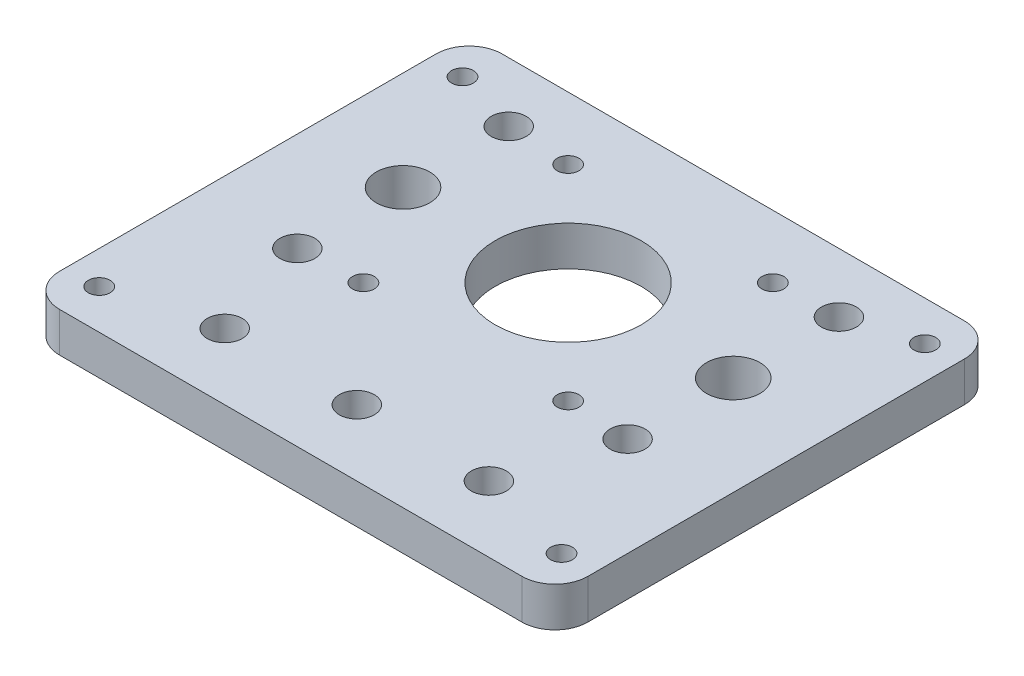
ISO-10303-21;
HEADER;
FILE_DESCRIPTION(('STEP AP214'),'2;1');
FILE_NAME('part.step','',(''),(''),'','','');
FILE_SCHEMA(('AUTOMOTIVE_DESIGN { 1 0 10303 214 1 1 1 1 }'));
ENDSEC;
DATA;
#1=APPLICATION_CONTEXT('core data for automotive mechanical design processes');
#2=APPLICATION_PROTOCOL_DEFINITION('international standard','automotive_design',2000,#1);
#3=PRODUCT_CONTEXT('',#1,'mechanical');
#4=PRODUCT('Part','Part','',(#3));
#5=PRODUCT_RELATED_PRODUCT_CATEGORY('part','',(#4));
#6=PRODUCT_DEFINITION_FORMATION('','',#4);
#7=PRODUCT_DEFINITION_CONTEXT('part definition',#1,'design');
#8=PRODUCT_DEFINITION('design','',#6,#7);
#9=PRODUCT_DEFINITION_SHAPE('','',#8);
#10=(LENGTH_UNIT() NAMED_UNIT(*) SI_UNIT(.MILLI.,.METRE.));
#11=(NAMED_UNIT(*) PLANE_ANGLE_UNIT() SI_UNIT($,.RADIAN.));
#12=(NAMED_UNIT(*) SI_UNIT($,.STERADIAN.) SOLID_ANGLE_UNIT());
#13=UNCERTAINTY_MEASURE_WITH_UNIT(LENGTH_MEASURE(1.E-05),#10,'distance_accuracy_value','');
#14=(GEOMETRIC_REPRESENTATION_CONTEXT(3) GLOBAL_UNCERTAINTY_ASSIGNED_CONTEXT((#13)) GLOBAL_UNIT_ASSIGNED_CONTEXT((#10,
#11,#12)) REPRESENTATION_CONTEXT('',''));
#15=CARTESIAN_POINT('',(0.,0.,0.));
#16=DIRECTION('',(0.,0.,1.));
#17=DIRECTION('',(1.,0.,0.));
#18=AXIS2_PLACEMENT_3D('',#15,#16,#17);
#19=CARTESIAN_POINT('',(-35.,6.,37.));
#20=DIRECTION('',(0.,1.,0.));
#21=DIRECTION('',(0.,0.,1.));
#22=AXIS2_PLACEMENT_3D('',#19,#20,#21);
#23=PLANE('',#22);
#24=CARTESIAN_POINT('',(35.,6.,36.));
#25=DIRECTION('',(0.,1.,0.));
#26=DIRECTION('',(0.,0.,-1.));
#27=AXIS2_PLACEMENT_3D('',#24,#25,#26);
#28=CIRCLE('',#27,1.65);
#29=CARTESIAN_POINT('',(35.,6.,34.35));
#30=VERTEX_POINT('',#29);
#31=EDGE_CURVE('E274',#30,#30,#28,.T.);
#32=ORIENTED_EDGE('',*,*,#31,.F.);
#33=EDGE_LOOP('',(#32));
#34=FACE_BOUND('',#33,.T.);
#35=CARTESIAN_POINT('',(20.,6.,32.));
#36=DIRECTION('',(0.,1.,0.));
#37=DIRECTION('',(0.,0.,1.));
#38=AXIS2_PLACEMENT_3D('',#35,#36,#37);
#39=CIRCLE('',#38,2.65);
#40=CARTESIAN_POINT('',(20.,6.,34.65));
#41=VERTEX_POINT('',#40);
#42=EDGE_CURVE('E262',#41,#41,#39,.T.);
#43=ORIENTED_EDGE('',*,*,#42,.F.);
#44=EDGE_LOOP('',(#43));
#45=FACE_BOUND('',#44,.T.);
#46=CARTESIAN_POINT('',(-35.,6.,36.));
#47=DIRECTION('',(0.,1.,0.));
#48=DIRECTION('',(0.,0.,1.));
#49=AXIS2_PLACEMENT_3D('',#46,#47,#48);
#50=CIRCLE('',#49,1.65);
#51=CARTESIAN_POINT('',(-35.,6.,37.65));
#52=VERTEX_POINT('',#51);
#53=EDGE_CURVE('E250',#52,#52,#50,.T.);
#54=ORIENTED_EDGE('',*,*,#53,.F.);
#55=EDGE_LOOP('',(#54));
#56=FACE_BOUND('',#55,.T.);
#57=CARTESIAN_POINT('',(25.,6.,-16.));
#58=DIRECTION('',(0.,1.,0.));
#59=DIRECTION('',(0.,0.,-1.));
#60=AXIS2_PLACEMENT_3D('',#57,#58,#59);
#61=CIRCLE('',#60,2.65);
#62=CARTESIAN_POINT('',(25.,6.,-18.65));
#63=VERTEX_POINT('',#62);
#64=EDGE_CURVE('E238',#63,#63,#61,.T.);
#65=ORIENTED_EDGE('',*,*,#64,.F.);
#66=EDGE_LOOP('',(#65));
#67=FACE_BOUND('',#66,.T.);
#68=CARTESIAN_POINT('',(25.,6.,0.));
#69=DIRECTION('',(0.,1.,0.));
#70=DIRECTION('',(0.,0.,-1.));
#71=AXIS2_PLACEMENT_3D('',#68,#69,#70);
#72=CIRCLE('',#71,4.05);
#73=CARTESIAN_POINT('',(25.,6.,-4.05));
#74=VERTEX_POINT('',#73);
#75=EDGE_CURVE('E226',#74,#74,#72,.T.);
#76=ORIENTED_EDGE('',*,*,#75,.F.);
#77=EDGE_LOOP('',(#76));
#78=FACE_BOUND('',#77,.T.);
#79=CARTESIAN_POINT('',(-25.,6.,-16.));
#80=DIRECTION('',(0.,1.,0.));
#81=DIRECTION('',(0.,0.,1.));
#82=AXIS2_PLACEMENT_3D('',#79,#80,#81);
#83=CIRCLE('',#82,2.65);
#84=CARTESIAN_POINT('',(-25.,6.,-13.35));
#85=VERTEX_POINT('',#84);
#86=EDGE_CURVE('E214',#85,#85,#83,.T.);
#87=ORIENTED_EDGE('',*,*,#86,.F.);
#88=EDGE_LOOP('',(#87));
#89=FACE_BOUND('',#88,.T.);
#90=CARTESIAN_POINT('',(-15.5,6.,15.5));
#91=DIRECTION('',(0.,1.,0.));
#92=DIRECTION('',(0.,0.,1.));
#93=AXIS2_PLACEMENT_3D('',#90,#91,#92);
#94=CIRCLE('',#93,1.65);
#95=CARTESIAN_POINT('',(-15.5,6.,17.15));
#96=VERTEX_POINT('',#95);
#97=EDGE_CURVE('E202',#96,#96,#94,.T.);
#98=ORIENTED_EDGE('',*,*,#97,.F.);
#99=EDGE_LOOP('',(#98));
#100=FACE_BOUND('',#99,.T.);
#101=CARTESIAN_POINT('',(15.5,6.,-15.5));
#102=DIRECTION('',(0.,1.,0.));
#103=DIRECTION('',(0.,0.,1.));
#104=AXIS2_PLACEMENT_3D('',#101,#102,#103);
#105=CIRCLE('',#104,1.65);
#106=CARTESIAN_POINT('',(15.5,6.,-13.85));
#107=VERTEX_POINT('',#106);
#108=EDGE_CURVE('E190',#107,#107,#105,.T.);
#109=ORIENTED_EDGE('',*,*,#108,.F.);
#110=EDGE_LOOP('',(#109));
#111=FACE_BOUND('',#110,.T.);
#112=CARTESIAN_POINT('',(0.,6.,0.));
#113=DIRECTION('',(0.,1.,0.));
#114=DIRECTION('',(0.,0.,1.));
#115=AXIS2_PLACEMENT_3D('',#112,#113,#114);
#116=CIRCLE('',#115,11.05);
#117=CARTESIAN_POINT('',(0.,6.,11.05));
#118=VERTEX_POINT('',#117);
#119=EDGE_CURVE('E136',#118,#118,#116,.T.);
#120=ORIENTED_EDGE('',*,*,#119,.F.);
#121=EDGE_LOOP('',(#120));
#122=FACE_BOUND('',#121,.T.);
#123=CARTESIAN_POINT('',(-35.,6.,37.));
#124=DIRECTION('',(0.,1.,0.));
#125=DIRECTION('',(0.,0.,1.));
#126=AXIS2_PLACEMENT_3D('',#123,#124,#125);
#127=CIRCLE('',#126,5.);
#128=CARTESIAN_POINT('',(-40.,6.,37.));
#129=VERTEX_POINT('',#128);
#130=CARTESIAN_POINT('',(-35.,6.,42.));
#131=VERTEX_POINT('',#130);
#132=EDGE_CURVE('E147',#129,#131,#127,.T.);
#133=ORIENTED_EDGE('',*,*,#132,.T.);
#134=DIRECTION('',(1.,0.,0.));
#135=VECTOR('',#134,1.);
#136=CARTESIAN_POINT('',(-35.,6.,42.));
#137=LINE('',#136,#135);
#138=CARTESIAN_POINT('',(35.,6.,42.));
#139=VERTEX_POINT('',#138);
#140=EDGE_CURVE('E95',#131,#139,#137,.T.);
#141=ORIENTED_EDGE('',*,*,#140,.T.);
#142=CARTESIAN_POINT('',(35.,6.,37.));
#143=DIRECTION('',(0.,1.,0.));
#144=DIRECTION('',(0.,0.,1.));
#145=AXIS2_PLACEMENT_3D('',#142,#143,#144);
#146=CIRCLE('',#145,5.);
#147=CARTESIAN_POINT('',(40.,6.,37.));
#148=VERTEX_POINT('',#147);
#149=EDGE_CURVE('E162',#139,#148,#146,.T.);
#150=ORIENTED_EDGE('',*,*,#149,.T.);
#151=DIRECTION('',(0.,0.,-1.));
#152=VECTOR('',#151,1.);
#153=CARTESIAN_POINT('',(40.,6.,-20.));
#154=LINE('',#153,#152);
#155=CARTESIAN_POINT('',(40.,6.,-20.));
#156=VERTEX_POINT('',#155);
#157=EDGE_CURVE('E175',#148,#156,#154,.T.);
#158=ORIENTED_EDGE('',*,*,#157,.T.);
#159=CARTESIAN_POINT('',(35.,6.,-20.));
#160=DIRECTION('',(0.,1.,0.));
#161=DIRECTION('',(0.,0.,1.));
#162=AXIS2_PLACEMENT_3D('',#159,#160,#161);
#163=CIRCLE('',#162,5.);
#164=CARTESIAN_POINT('',(35.,6.,-25.));
#165=VERTEX_POINT('',#164);
#166=EDGE_CURVE('E114',#156,#165,#163,.T.);
#167=ORIENTED_EDGE('',*,*,#166,.T.);
#168=DIRECTION('',(-1.,0.,0.));
#169=VECTOR('',#168,1.);
#170=CARTESIAN_POINT('',(-35.,6.,-25.));
#171=LINE('',#170,#169);
#172=CARTESIAN_POINT('',(-35.,6.,-25.));
#173=VERTEX_POINT('',#172);
#174=EDGE_CURVE('E108',#165,#173,#171,.T.);
#175=ORIENTED_EDGE('',*,*,#174,.T.);
#176=CARTESIAN_POINT('',(-35.,6.,-20.));
#177=DIRECTION('',(0.,1.,0.));
#178=DIRECTION('',(0.,0.,1.));
#179=AXIS2_PLACEMENT_3D('',#176,#177,#178);
#180=CIRCLE('',#179,5.);
#181=CARTESIAN_POINT('',(-40.,6.,-20.));
#182=VERTEX_POINT('',#181);
#183=EDGE_CURVE('E112',#173,#182,#180,.T.);
#184=ORIENTED_EDGE('',*,*,#183,.T.);
#185=DIRECTION('',(0.,0.,1.));
#186=VECTOR('',#185,1.);
#187=CARTESIAN_POINT('',(-40.,6.,-20.));
#188=LINE('',#187,#186);
#189=EDGE_CURVE('E52',#182,#129,#188,.T.);
#190=ORIENTED_EDGE('',*,*,#189,.T.);
#191=EDGE_LOOP('',(#133,#141,#150,#158,#167,#175,#184,#190));
#192=FACE_BOUND('',#191,.T.);
#193=CARTESIAN_POINT('',(-15.5,6.,-15.5));
#194=DIRECTION('',(0.,1.,0.));
#195=DIRECTION('',(0.,0.,1.));
#196=AXIS2_PLACEMENT_3D('',#193,#194,#195);
#197=CIRCLE('',#196,1.65);
#198=CARTESIAN_POINT('',(-15.5,6.,-13.85));
#199=VERTEX_POINT('',#198);
#200=EDGE_CURVE('E184',#199,#199,#197,.T.);
#201=ORIENTED_EDGE('',*,*,#200,.F.);
#202=EDGE_LOOP('',(#201));
#203=FACE_BOUND('',#202,.T.);
#204=CARTESIAN_POINT('',(15.5,6.,15.5));
#205=DIRECTION('',(0.,1.,0.));
#206=DIRECTION('',(0.,0.,1.));
#207=AXIS2_PLACEMENT_3D('',#204,#205,#206);
#208=CIRCLE('',#207,1.65);
#209=CARTESIAN_POINT('',(15.5,6.,17.15));
#210=VERTEX_POINT('',#209);
#211=EDGE_CURVE('E196',#210,#210,#208,.T.);
#212=ORIENTED_EDGE('',*,*,#211,.F.);
#213=EDGE_LOOP('',(#212));
#214=FACE_BOUND('',#213,.T.);
#215=CARTESIAN_POINT('',(-25.,6.,0.));
#216=DIRECTION('',(0.,1.,0.));
#217=DIRECTION('',(0.,0.,1.));
#218=AXIS2_PLACEMENT_3D('',#215,#216,#217);
#219=CIRCLE('',#218,4.05);
#220=CARTESIAN_POINT('',(-25.,6.,4.05));
#221=VERTEX_POINT('',#220);
#222=EDGE_CURVE('E208',#221,#221,#219,.T.);
#223=ORIENTED_EDGE('',*,*,#222,.F.);
#224=EDGE_LOOP('',(#223));
#225=FACE_BOUND('',#224,.T.);
#226=CARTESIAN_POINT('',(-25.,6.,16.));
#227=DIRECTION('',(0.,1.,0.));
#228=DIRECTION('',(0.,0.,-1.));
#229=AXIS2_PLACEMENT_3D('',#226,#227,#228);
#230=CIRCLE('',#229,2.65);
#231=CARTESIAN_POINT('',(-25.,6.,13.35));
#232=VERTEX_POINT('',#231);
#233=EDGE_CURVE('E220',#232,#232,#230,.T.);
#234=ORIENTED_EDGE('',*,*,#233,.F.);
#235=EDGE_LOOP('',(#234));
#236=FACE_BOUND('',#235,.T.);
#237=CARTESIAN_POINT('',(25.,6.,16.));
#238=DIRECTION('',(0.,1.,0.));
#239=DIRECTION('',(0.,0.,1.));
#240=AXIS2_PLACEMENT_3D('',#237,#238,#239);
#241=CIRCLE('',#240,2.65);
#242=CARTESIAN_POINT('',(25.,6.,18.65));
#243=VERTEX_POINT('',#242);
#244=EDGE_CURVE('E232',#243,#243,#241,.T.);
#245=ORIENTED_EDGE('',*,*,#244,.F.);
#246=EDGE_LOOP('',(#245));
#247=FACE_BOUND('',#246,.T.);
#248=CARTESIAN_POINT('',(-20.,6.,32.));
#249=DIRECTION('',(0.,1.,0.));
#250=DIRECTION('',(0.,0.,1.));
#251=AXIS2_PLACEMENT_3D('',#248,#249,#250);
#252=CIRCLE('',#251,2.65);
#253=CARTESIAN_POINT('',(-20.,6.,34.65));
#254=VERTEX_POINT('',#253);
#255=EDGE_CURVE('E244',#254,#254,#252,.T.);
#256=ORIENTED_EDGE('',*,*,#255,.F.);
#257=EDGE_LOOP('',(#256));
#258=FACE_BOUND('',#257,.T.);
#259=CARTESIAN_POINT('',(0.,6.,32.));
#260=DIRECTION('',(0.,1.,0.));
#261=DIRECTION('',(0.,0.,1.));
#262=AXIS2_PLACEMENT_3D('',#259,#260,#261);
#263=CIRCLE('',#262,2.65);
#264=CARTESIAN_POINT('',(0.,6.,34.65));
#265=VERTEX_POINT('',#264);
#266=EDGE_CURVE('E256',#265,#265,#263,.T.);
#267=ORIENTED_EDGE('',*,*,#266,.F.);
#268=EDGE_LOOP('',(#267));
#269=FACE_BOUND('',#268,.T.);
#270=CARTESIAN_POINT('',(-35.,6.,-19.));
#271=DIRECTION('',(0.,1.,0.));
#272=DIRECTION('',(0.,0.,1.));
#273=AXIS2_PLACEMENT_3D('',#270,#271,#272);
#274=CIRCLE('',#273,1.65);
#275=CARTESIAN_POINT('',(-35.,6.,-17.35));
#276=VERTEX_POINT('',#275);
#277=EDGE_CURVE('E268',#276,#276,#274,.T.);
#278=ORIENTED_EDGE('',*,*,#277,.F.);
#279=EDGE_LOOP('',(#278));
#280=FACE_BOUND('',#279,.T.);
#281=CARTESIAN_POINT('',(35.,6.,-19.));
#282=DIRECTION('',(0.,1.,0.));
#283=DIRECTION('',(0.,0.,-1.));
#284=AXIS2_PLACEMENT_3D('',#281,#282,#283);
#285=CIRCLE('',#284,1.65);
#286=CARTESIAN_POINT('',(35.,6.,-20.65));
#287=VERTEX_POINT('',#286);
#288=EDGE_CURVE('E280',#287,#287,#285,.T.);
#289=ORIENTED_EDGE('',*,*,#288,.F.);
#290=EDGE_LOOP('',(#289));
#291=FACE_BOUND('',#290,.T.);
#292=ADVANCED_FACE('F35',(#34,#45,#56,#67,#78,#89,#100,#111,#122,#192,#203,#214,#225,#236,#247,
#258,#269,#280,#291),#23,.T.);
#293=CARTESIAN_POINT('',(-35.,0.,37.));
#294=DIRECTION('',(0.,1.,0.));
#295=DIRECTION('',(0.,0.,1.));
#296=AXIS2_PLACEMENT_3D('',#293,#294,#295);
#297=PLANE('',#296);
#298=CARTESIAN_POINT('',(-35.,0.,37.));
#299=DIRECTION('',(0.,1.,0.));
#300=DIRECTION('',(0.,0.,1.));
#301=AXIS2_PLACEMENT_3D('',#298,#299,#300);
#302=CIRCLE('',#301,5.);
#303=CARTESIAN_POINT('',(-40.,0.,37.));
#304=VERTEX_POINT('',#303);
#305=CARTESIAN_POINT('',(-35.,0.,42.));
#306=VERTEX_POINT('',#305);
#307=EDGE_CURVE('E132',#304,#306,#302,.T.);
#308=ORIENTED_EDGE('',*,*,#307,.F.);
#309=DIRECTION('',(0.,0.,1.));
#310=VECTOR('',#309,1.);
#311=CARTESIAN_POINT('',(-40.,0.,-20.));
#312=LINE('',#311,#310);
#313=CARTESIAN_POINT('',(-40.,0.,-20.));
#314=VERTEX_POINT('',#313);
#315=EDGE_CURVE('E87',#314,#304,#312,.T.);
#316=ORIENTED_EDGE('',*,*,#315,.F.);
#317=CARTESIAN_POINT('',(-35.,0.,-20.));
#318=DIRECTION('',(0.,1.,0.));
#319=DIRECTION('',(0.,0.,1.));
#320=AXIS2_PLACEMENT_3D('',#317,#318,#319);
#321=CIRCLE('',#320,5.);
#322=CARTESIAN_POINT('',(-35.,0.,-25.));
#323=VERTEX_POINT('',#322);
#324=EDGE_CURVE('E81',#323,#314,#321,.T.);
#325=ORIENTED_EDGE('',*,*,#324,.F.);
#326=DIRECTION('',(-1.,0.,0.));
#327=VECTOR('',#326,1.);
#328=CARTESIAN_POINT('',(-35.,0.,-25.));
#329=LINE('',#328,#327);
#330=CARTESIAN_POINT('',(35.,0.,-25.));
#331=VERTEX_POINT('',#330);
#332=EDGE_CURVE('E122',#331,#323,#329,.T.);
#333=ORIENTED_EDGE('',*,*,#332,.F.);
#334=CARTESIAN_POINT('',(35.,0.,-20.));
#335=DIRECTION('',(0.,1.,0.));
#336=DIRECTION('',(0.,0.,1.));
#337=AXIS2_PLACEMENT_3D('',#334,#335,#336);
#338=CIRCLE('',#337,5.);
#339=CARTESIAN_POINT('',(40.,0.,-20.));
#340=VERTEX_POINT('',#339);
#341=EDGE_CURVE('E142',#340,#331,#338,.T.);
#342=ORIENTED_EDGE('',*,*,#341,.F.);
#343=DIRECTION('',(0.,0.,-1.));
#344=VECTOR('',#343,1.);
#345=CARTESIAN_POINT('',(40.,0.,-20.));
#346=LINE('',#345,#344);
#347=CARTESIAN_POINT('',(40.,0.,37.));
#348=VERTEX_POINT('',#347);
#349=EDGE_CURVE('E140',#348,#340,#346,.T.);
#350=ORIENTED_EDGE('',*,*,#349,.F.);
#351=CARTESIAN_POINT('',(35.,0.,37.));
#352=DIRECTION('',(0.,1.,0.));
#353=DIRECTION('',(0.,0.,1.));
#354=AXIS2_PLACEMENT_3D('',#351,#352,#353);
#355=CIRCLE('',#354,5.);
#356=CARTESIAN_POINT('',(35.,0.,42.));
#357=VERTEX_POINT('',#356);
#358=EDGE_CURVE('E138',#357,#348,#355,.T.);
#359=ORIENTED_EDGE('',*,*,#358,.F.);
#360=DIRECTION('',(1.,0.,0.));
#361=VECTOR('',#360,1.);
#362=CARTESIAN_POINT('',(-35.,0.,42.));
#363=LINE('',#362,#361);
#364=EDGE_CURVE('E135',#306,#357,#363,.T.);
#365=ORIENTED_EDGE('',*,*,#364,.F.);
#366=EDGE_LOOP('',(#308,#316,#325,#333,#342,#350,#359,#365));
#367=FACE_BOUND('',#366,.T.);
#368=CARTESIAN_POINT('',(0.,0.,0.));
#369=DIRECTION('',(0.,1.,0.));
#370=DIRECTION('',(0.,0.,1.));
#371=AXIS2_PLACEMENT_3D('',#368,#369,#370);
#372=CIRCLE('',#371,11.05);
#373=CARTESIAN_POINT('',(0.,0.,11.05));
#374=VERTEX_POINT('',#373);
#375=EDGE_CURVE('E181',#374,#374,#372,.T.);
#376=ORIENTED_EDGE('',*,*,#375,.T.);
#377=EDGE_LOOP('',(#376));
#378=FACE_BOUND('',#377,.T.);
#379=CARTESIAN_POINT('',(-15.5,0.,-15.5));
#380=DIRECTION('',(0.,1.,0.));
#381=DIRECTION('',(0.,0.,1.));
#382=AXIS2_PLACEMENT_3D('',#379,#380,#381);
#383=CIRCLE('',#382,1.65);
#384=CARTESIAN_POINT('',(-15.5,0.,-13.85));
#385=VERTEX_POINT('',#384);
#386=EDGE_CURVE('E187',#385,#385,#383,.T.);
#387=ORIENTED_EDGE('',*,*,#386,.T.);
#388=EDGE_LOOP('',(#387));
#389=FACE_BOUND('',#388,.T.);
#390=CARTESIAN_POINT('',(15.5,0.,-15.5));
#391=DIRECTION('',(0.,1.,0.));
#392=DIRECTION('',(0.,0.,1.));
#393=AXIS2_PLACEMENT_3D('',#390,#391,#392);
#394=CIRCLE('',#393,1.65);
#395=CARTESIAN_POINT('',(15.5,0.,-13.85));
#396=VERTEX_POINT('',#395);
#397=EDGE_CURVE('E193',#396,#396,#394,.T.);
#398=ORIENTED_EDGE('',*,*,#397,.T.);
#399=EDGE_LOOP('',(#398));
#400=FACE_BOUND('',#399,.T.);
#401=CARTESIAN_POINT('',(15.5,0.,15.5));
#402=DIRECTION('',(0.,1.,0.));
#403=DIRECTION('',(0.,0.,1.));
#404=AXIS2_PLACEMENT_3D('',#401,#402,#403);
#405=CIRCLE('',#404,1.65);
#406=CARTESIAN_POINT('',(15.5,0.,17.15));
#407=VERTEX_POINT('',#406);
#408=EDGE_CURVE('E199',#407,#407,#405,.T.);
#409=ORIENTED_EDGE('',*,*,#408,.T.);
#410=EDGE_LOOP('',(#409));
#411=FACE_BOUND('',#410,.T.);
#412=CARTESIAN_POINT('',(-15.5,0.,15.5));
#413=DIRECTION('',(0.,1.,0.));
#414=DIRECTION('',(0.,0.,1.));
#415=AXIS2_PLACEMENT_3D('',#412,#413,#414);
#416=CIRCLE('',#415,1.65);
#417=CARTESIAN_POINT('',(-15.5,0.,17.15));
#418=VERTEX_POINT('',#417);
#419=EDGE_CURVE('E205',#418,#418,#416,.T.);
#420=ORIENTED_EDGE('',*,*,#419,.T.);
#421=EDGE_LOOP('',(#420));
#422=FACE_BOUND('',#421,.T.);
#423=CARTESIAN_POINT('',(-25.,0.,0.));
#424=DIRECTION('',(0.,1.,0.));
#425=DIRECTION('',(0.,0.,1.));
#426=AXIS2_PLACEMENT_3D('',#423,#424,#425);
#427=CIRCLE('',#426,4.05);
#428=CARTESIAN_POINT('',(-25.,0.,4.05));
#429=VERTEX_POINT('',#428);
#430=EDGE_CURVE('E211',#429,#429,#427,.T.);
#431=ORIENTED_EDGE('',*,*,#430,.T.);
#432=EDGE_LOOP('',(#431));
#433=FACE_BOUND('',#432,.T.);
#434=CARTESIAN_POINT('',(-25.,0.,-16.));
#435=DIRECTION('',(0.,1.,0.));
#436=DIRECTION('',(0.,0.,1.));
#437=AXIS2_PLACEMENT_3D('',#434,#435,#436);
#438=CIRCLE('',#437,2.65);
#439=CARTESIAN_POINT('',(-25.,0.,-13.35));
#440=VERTEX_POINT('',#439);
#441=EDGE_CURVE('E217',#440,#440,#438,.T.);
#442=ORIENTED_EDGE('',*,*,#441,.T.);
#443=EDGE_LOOP('',(#442));
#444=FACE_BOUND('',#443,.T.);
#445=CARTESIAN_POINT('',(-25.,0.,16.));
#446=DIRECTION('',(0.,1.,0.));
#447=DIRECTION('',(0.,0.,-1.));
#448=AXIS2_PLACEMENT_3D('',#445,#446,#447);
#449=CIRCLE('',#448,2.65);
#450=CARTESIAN_POINT('',(-25.,0.,13.35));
#451=VERTEX_POINT('',#450);
#452=EDGE_CURVE('E223',#451,#451,#449,.T.);
#453=ORIENTED_EDGE('',*,*,#452,.T.);
#454=EDGE_LOOP('',(#453));
#455=FACE_BOUND('',#454,.T.);
#456=CARTESIAN_POINT('',(25.,0.,0.));
#457=DIRECTION('',(0.,1.,0.));
#458=DIRECTION('',(0.,0.,-1.));
#459=AXIS2_PLACEMENT_3D('',#456,#457,#458);
#460=CIRCLE('',#459,4.05);
#461=CARTESIAN_POINT('',(25.,0.,-4.05));
#462=VERTEX_POINT('',#461);
#463=EDGE_CURVE('E229',#462,#462,#460,.T.);
#464=ORIENTED_EDGE('',*,*,#463,.T.);
#465=EDGE_LOOP('',(#464));
#466=FACE_BOUND('',#465,.T.);
#467=CARTESIAN_POINT('',(25.,0.,16.));
#468=DIRECTION('',(0.,1.,0.));
#469=DIRECTION('',(0.,0.,1.));
#470=AXIS2_PLACEMENT_3D('',#467,#468,#469);
#471=CIRCLE('',#470,2.65);
#472=CARTESIAN_POINT('',(25.,0.,18.65));
#473=VERTEX_POINT('',#472);
#474=EDGE_CURVE('E235',#473,#473,#471,.T.);
#475=ORIENTED_EDGE('',*,*,#474,.T.);
#476=EDGE_LOOP('',(#475));
#477=FACE_BOUND('',#476,.T.);
#478=CARTESIAN_POINT('',(25.,0.,-16.));
#479=DIRECTION('',(0.,1.,0.));
#480=DIRECTION('',(0.,0.,-1.));
#481=AXIS2_PLACEMENT_3D('',#478,#479,#480);
#482=CIRCLE('',#481,2.65);
#483=CARTESIAN_POINT('',(25.,0.,-18.65));
#484=VERTEX_POINT('',#483);
#485=EDGE_CURVE('E241',#484,#484,#482,.T.);
#486=ORIENTED_EDGE('',*,*,#485,.T.);
#487=EDGE_LOOP('',(#486));
#488=FACE_BOUND('',#487,.T.);
#489=CARTESIAN_POINT('',(-20.,0.,32.));
#490=DIRECTION('',(0.,1.,0.));
#491=DIRECTION('',(0.,0.,1.));
#492=AXIS2_PLACEMENT_3D('',#489,#490,#491);
#493=CIRCLE('',#492,2.65);
#494=CARTESIAN_POINT('',(-20.,0.,34.65));
#495=VERTEX_POINT('',#494);
#496=EDGE_CURVE('E247',#495,#495,#493,.T.);
#497=ORIENTED_EDGE('',*,*,#496,.T.);
#498=EDGE_LOOP('',(#497));
#499=FACE_BOUND('',#498,.T.);
#500=CARTESIAN_POINT('',(-35.,0.,36.));
#501=DIRECTION('',(0.,1.,0.));
#502=DIRECTION('',(0.,0.,1.));
#503=AXIS2_PLACEMENT_3D('',#500,#501,#502);
#504=CIRCLE('',#503,1.65);
#505=CARTESIAN_POINT('',(-35.,0.,37.65));
#506=VERTEX_POINT('',#505);
#507=EDGE_CURVE('E253',#506,#506,#504,.T.);
#508=ORIENTED_EDGE('',*,*,#507,.T.);
#509=EDGE_LOOP('',(#508));
#510=FACE_BOUND('',#509,.T.);
#511=CARTESIAN_POINT('',(0.,0.,32.));
#512=DIRECTION('',(0.,1.,0.));
#513=DIRECTION('',(0.,0.,1.));
#514=AXIS2_PLACEMENT_3D('',#511,#512,#513);
#515=CIRCLE('',#514,2.65);
#516=CARTESIAN_POINT('',(0.,0.,34.65));
#517=VERTEX_POINT('',#516);
#518=EDGE_CURVE('E259',#517,#517,#515,.T.);
#519=ORIENTED_EDGE('',*,*,#518,.T.);
#520=EDGE_LOOP('',(#519));
#521=FACE_BOUND('',#520,.T.);
#522=CARTESIAN_POINT('',(20.,0.,32.));
#523=DIRECTION('',(0.,1.,0.));
#524=DIRECTION('',(0.,0.,1.));
#525=AXIS2_PLACEMENT_3D('',#522,#523,#524);
#526=CIRCLE('',#525,2.65);
#527=CARTESIAN_POINT('',(20.,0.,34.65));
#528=VERTEX_POINT('',#527);
#529=EDGE_CURVE('E265',#528,#528,#526,.T.);
#530=ORIENTED_EDGE('',*,*,#529,.T.);
#531=EDGE_LOOP('',(#530));
#532=FACE_BOUND('',#531,.T.);
#533=CARTESIAN_POINT('',(-35.,0.,-19.));
#534=DIRECTION('',(0.,1.,0.));
#535=DIRECTION('',(0.,0.,1.));
#536=AXIS2_PLACEMENT_3D('',#533,#534,#535);
#537=CIRCLE('',#536,1.65);
#538=CARTESIAN_POINT('',(-35.,0.,-17.35));
#539=VERTEX_POINT('',#538);
#540=EDGE_CURVE('E271',#539,#539,#537,.T.);
#541=ORIENTED_EDGE('',*,*,#540,.T.);
#542=EDGE_LOOP('',(#541));
#543=FACE_BOUND('',#542,.T.);
#544=CARTESIAN_POINT('',(35.,0.,36.));
#545=DIRECTION('',(0.,1.,0.));
#546=DIRECTION('',(0.,0.,-1.));
#547=AXIS2_PLACEMENT_3D('',#544,#545,#546);
#548=CIRCLE('',#547,1.65);
#549=CARTESIAN_POINT('',(35.,0.,34.35));
#550=VERTEX_POINT('',#549);
#551=EDGE_CURVE('E277',#550,#550,#548,.T.);
#552=ORIENTED_EDGE('',*,*,#551,.T.);
#553=EDGE_LOOP('',(#552));
#554=FACE_BOUND('',#553,.T.);
#555=CARTESIAN_POINT('',(35.,0.,-19.));
#556=DIRECTION('',(0.,1.,0.));
#557=DIRECTION('',(0.,0.,-1.));
#558=AXIS2_PLACEMENT_3D('',#555,#556,#557);
#559=CIRCLE('',#558,1.65);
#560=CARTESIAN_POINT('',(35.,0.,-20.65));
#561=VERTEX_POINT('',#560);
#562=EDGE_CURVE('E283',#561,#561,#559,.T.);
#563=ORIENTED_EDGE('',*,*,#562,.T.);
#564=EDGE_LOOP('',(#563));
#565=FACE_BOUND('',#564,.T.);
#566=ADVANCED_FACE('F166',(#367,#378,#389,#400,#411,#422,#433,#444,#455,#466,#477,#488,#499,
#510,#521,#532,#543,#554,#565),#297,.F.);
#567=CARTESIAN_POINT('',(-35.,6.,37.));
#568=DIRECTION('',(0.,-1.,0.));
#569=DIRECTION('',(0.,0.,-1.));
#570=AXIS2_PLACEMENT_3D('',#567,#568,#569);
#571=CYLINDRICAL_SURFACE('',#570,5.);
#572=ORIENTED_EDGE('',*,*,#307,.T.);
#573=DIRECTION('',(0.,-1.,0.));
#574=VECTOR('',#573,1.);
#575=CARTESIAN_POINT('',(-35.,6.,42.));
#576=LINE('',#575,#574);
#577=EDGE_CURVE('E11',#131,#306,#576,.T.);
#578=ORIENTED_EDGE('',*,*,#577,.F.);
#579=ORIENTED_EDGE('',*,*,#132,.F.);
#580=DIRECTION('',(0.,-1.,0.));
#581=VECTOR('',#580,1.);
#582=CARTESIAN_POINT('',(-40.,6.,37.));
#583=LINE('',#582,#581);
#584=EDGE_CURVE('E128',#129,#304,#583,.T.);
#585=ORIENTED_EDGE('',*,*,#584,.T.);
#586=EDGE_LOOP('',(#572,#578,#579,#585));
#587=FACE_BOUND('',#586,.T.);
#588=ADVANCED_FACE('F37',(#587),#571,.T.);
#589=CARTESIAN_POINT('',(-35.,6.,42.));
#590=DIRECTION('',(0.,0.,-1.));
#591=DIRECTION('',(-1.,0.,0.));
#592=AXIS2_PLACEMENT_3D('',#589,#590,#591);
#593=PLANE('',#592);
#594=ORIENTED_EDGE('',*,*,#364,.T.);
#595=DIRECTION('',(0.,-1.,0.));
#596=VECTOR('',#595,1.);
#597=CARTESIAN_POINT('',(35.,6.,42.));
#598=LINE('',#597,#596);
#599=EDGE_CURVE('E44',#139,#357,#598,.T.);
#600=ORIENTED_EDGE('',*,*,#599,.F.);
#601=ORIENTED_EDGE('',*,*,#140,.F.);
#602=ORIENTED_EDGE('',*,*,#577,.T.);
#603=EDGE_LOOP('',(#594,#600,#601,#602));
#604=FACE_BOUND('',#603,.T.);
#605=ADVANCED_FACE('F317',(#604),#593,.F.);
#606=CARTESIAN_POINT('',(35.,6.,37.));
#607=DIRECTION('',(0.,-1.,0.));
#608=DIRECTION('',(0.,0.,-1.));
#609=AXIS2_PLACEMENT_3D('',#606,#607,#608);
#610=CYLINDRICAL_SURFACE('',#609,5.);
#611=ORIENTED_EDGE('',*,*,#358,.T.);
#612=DIRECTION('',(0.,-1.,0.));
#613=VECTOR('',#612,1.);
#614=CARTESIAN_POINT('',(40.,6.,37.));
#615=LINE('',#614,#613);
#616=EDGE_CURVE('E154',#148,#348,#615,.T.);
#617=ORIENTED_EDGE('',*,*,#616,.F.);
#618=ORIENTED_EDGE('',*,*,#149,.F.);
#619=ORIENTED_EDGE('',*,*,#599,.T.);
#620=EDGE_LOOP('',(#611,#617,#618,#619));
#621=FACE_BOUND('',#620,.T.);
#622=ADVANCED_FACE('F160',(#621),#610,.T.);
#623=CARTESIAN_POINT('',(40.,6.,-20.));
#624=DIRECTION('',(-1.,0.,0.));
#625=DIRECTION('',(0.,0.,1.));
#626=AXIS2_PLACEMENT_3D('',#623,#624,#625);
#627=PLANE('',#626);
#628=ORIENTED_EDGE('',*,*,#349,.T.);
#629=DIRECTION('',(0.,-1.,0.));
#630=VECTOR('',#629,1.);
#631=CARTESIAN_POINT('',(40.,6.,-20.));
#632=LINE('',#631,#630);
#633=EDGE_CURVE('E151',#156,#340,#632,.T.);
#634=ORIENTED_EDGE('',*,*,#633,.F.);
#635=ORIENTED_EDGE('',*,*,#157,.F.);
#636=ORIENTED_EDGE('',*,*,#616,.T.);
#637=EDGE_LOOP('',(#628,#634,#635,#636));
#638=FACE_BOUND('',#637,.T.);
#639=ADVANCED_FACE('F171',(#638),#627,.F.);
#640=CARTESIAN_POINT('',(35.,6.,-20.));
#641=DIRECTION('',(0.,-1.,0.));
#642=DIRECTION('',(0.,0.,-1.));
#643=AXIS2_PLACEMENT_3D('',#640,#641,#642);
#644=CYLINDRICAL_SURFACE('',#643,5.);
#645=ORIENTED_EDGE('',*,*,#341,.T.);
#646=DIRECTION('',(0.,-1.,0.));
#647=VECTOR('',#646,1.);
#648=CARTESIAN_POINT('',(35.,6.,-25.));
#649=LINE('',#648,#647);
#650=EDGE_CURVE('E123',#165,#331,#649,.T.);
#651=ORIENTED_EDGE('',*,*,#650,.F.);
#652=ORIENTED_EDGE('',*,*,#166,.F.);
#653=ORIENTED_EDGE('',*,*,#633,.T.);
#654=EDGE_LOOP('',(#645,#651,#652,#653));
#655=FACE_BOUND('',#654,.T.);
#656=ADVANCED_FACE('F174',(#655),#644,.T.);
#657=CARTESIAN_POINT('',(-35.,6.,-25.));
#658=DIRECTION('',(0.,0.,1.));
#659=DIRECTION('',(1.,0.,0.));
#660=AXIS2_PLACEMENT_3D('',#657,#658,#659);
#661=PLANE('',#660);
#662=ORIENTED_EDGE('',*,*,#332,.T.);
#663=DIRECTION('',(0.,-1.,0.));
#664=VECTOR('',#663,1.);
#665=CARTESIAN_POINT('',(-35.,6.,-25.));
#666=LINE('',#665,#664);
#667=EDGE_CURVE('E119',#173,#323,#666,.T.);
#668=ORIENTED_EDGE('',*,*,#667,.F.);
#669=ORIENTED_EDGE('',*,*,#174,.F.);
#670=ORIENTED_EDGE('',*,*,#650,.T.);
#671=EDGE_LOOP('',(#662,#668,#669,#670));
#672=FACE_BOUND('',#671,.T.);
#673=ADVANCED_FACE('F120',(#672),#661,.F.);
#674=CARTESIAN_POINT('',(-35.,6.,-20.));
#675=DIRECTION('',(0.,-1.,0.));
#676=DIRECTION('',(0.,0.,-1.));
#677=AXIS2_PLACEMENT_3D('',#674,#675,#676);
#678=CYLINDRICAL_SURFACE('',#677,5.);
#679=ORIENTED_EDGE('',*,*,#324,.T.);
#680=DIRECTION('',(0.,-1.,0.));
#681=VECTOR('',#680,1.);
#682=CARTESIAN_POINT('',(-40.,6.,-20.));
#683=LINE('',#682,#681);
#684=EDGE_CURVE('E124',#182,#314,#683,.T.);
#685=ORIENTED_EDGE('',*,*,#684,.F.);
#686=ORIENTED_EDGE('',*,*,#183,.F.);
#687=ORIENTED_EDGE('',*,*,#667,.T.);
#688=EDGE_LOOP('',(#679,#685,#686,#687));
#689=FACE_BOUND('',#688,.T.);
#690=ADVANCED_FACE('F126',(#689),#678,.T.);
#691=CARTESIAN_POINT('',(-40.,6.,-20.));
#692=DIRECTION('',(1.,0.,0.));
#693=DIRECTION('',(0.,0.,-1.));
#694=AXIS2_PLACEMENT_3D('',#691,#692,#693);
#695=PLANE('',#694);
#696=ORIENTED_EDGE('',*,*,#315,.T.);
#697=ORIENTED_EDGE('',*,*,#584,.F.);
#698=ORIENTED_EDGE('',*,*,#189,.F.);
#699=ORIENTED_EDGE('',*,*,#684,.T.);
#700=EDGE_LOOP('',(#696,#697,#698,#699));
#701=FACE_BOUND('',#700,.T.);
#702=ADVANCED_FACE('F305',(#701),#695,.F.);
#703=CARTESIAN_POINT('',(0.,6.,0.));
#704=DIRECTION('',(0.,-1.,0.));
#705=DIRECTION('',(0.,0.,-1.));
#706=AXIS2_PLACEMENT_3D('',#703,#704,#705);
#707=CYLINDRICAL_SURFACE('',#706,11.05);
#708=ORIENTED_EDGE('',*,*,#119,.T.);
#709=EDGE_LOOP('',(#708));
#710=FACE_BOUND('',#709,.T.);
#711=ORIENTED_EDGE('',*,*,#375,.F.);
#712=EDGE_LOOP('',(#711));
#713=FACE_BOUND('',#712,.T.);
#714=ADVANCED_FACE('F302',(#710,#713),#707,.F.);
#715=CARTESIAN_POINT('',(-15.5,6.,-15.5));
#716=DIRECTION('',(0.,-1.,0.));
#717=DIRECTION('',(0.,0.,-1.));
#718=AXIS2_PLACEMENT_3D('',#715,#716,#717);
#719=CYLINDRICAL_SURFACE('',#718,1.65);
#720=ORIENTED_EDGE('',*,*,#200,.T.);
#721=EDGE_LOOP('',(#720));
#722=FACE_BOUND('',#721,.T.);
#723=ORIENTED_EDGE('',*,*,#386,.F.);
#724=EDGE_LOOP('',(#723));
#725=FACE_BOUND('',#724,.T.);
#726=ADVANCED_FACE('F381',(#722,#725),#719,.F.);
#727=CARTESIAN_POINT('',(15.5,6.,-15.5));
#728=DIRECTION('',(0.,-1.,0.));
#729=DIRECTION('',(0.,0.,-1.));
#730=AXIS2_PLACEMENT_3D('',#727,#728,#729);
#731=CYLINDRICAL_SURFACE('',#730,1.65);
#732=ORIENTED_EDGE('',*,*,#108,.T.);
#733=EDGE_LOOP('',(#732));
#734=FACE_BOUND('',#733,.T.);
#735=ORIENTED_EDGE('',*,*,#397,.F.);
#736=EDGE_LOOP('',(#735));
#737=FACE_BOUND('',#736,.T.);
#738=ADVANCED_FACE('F389',(#734,#737),#731,.F.);
#739=CARTESIAN_POINT('',(15.5,6.,15.5));
#740=DIRECTION('',(0.,-1.,0.));
#741=DIRECTION('',(0.,0.,-1.));
#742=AXIS2_PLACEMENT_3D('',#739,#740,#741);
#743=CYLINDRICAL_SURFACE('',#742,1.65);
#744=ORIENTED_EDGE('',*,*,#211,.T.);
#745=EDGE_LOOP('',(#744));
#746=FACE_BOUND('',#745,.T.);
#747=ORIENTED_EDGE('',*,*,#408,.F.);
#748=EDGE_LOOP('',(#747));
#749=FACE_BOUND('',#748,.T.);
#750=ADVANCED_FACE('F397',(#746,#749),#743,.F.);
#751=CARTESIAN_POINT('',(-15.5,6.,15.5));
#752=DIRECTION('',(0.,-1.,0.));
#753=DIRECTION('',(0.,0.,-1.));
#754=AXIS2_PLACEMENT_3D('',#751,#752,#753);
#755=CYLINDRICAL_SURFACE('',#754,1.65);
#756=ORIENTED_EDGE('',*,*,#97,.T.);
#757=EDGE_LOOP('',(#756));
#758=FACE_BOUND('',#757,.T.);
#759=ORIENTED_EDGE('',*,*,#419,.F.);
#760=EDGE_LOOP('',(#759));
#761=FACE_BOUND('',#760,.T.);
#762=ADVANCED_FACE('F406',(#758,#761),#755,.F.);
#763=CARTESIAN_POINT('',(-25.,6.,0.));
#764=DIRECTION('',(0.,-1.,0.));
#765=DIRECTION('',(0.,0.,-1.));
#766=AXIS2_PLACEMENT_3D('',#763,#764,#765);
#767=CYLINDRICAL_SURFACE('',#766,4.05);
#768=ORIENTED_EDGE('',*,*,#222,.T.);
#769=EDGE_LOOP('',(#768));
#770=FACE_BOUND('',#769,.T.);
#771=ORIENTED_EDGE('',*,*,#430,.F.);
#772=EDGE_LOOP('',(#771));
#773=FACE_BOUND('',#772,.T.);
#774=ADVANCED_FACE('F415',(#770,#773),#767,.F.);
#775=CARTESIAN_POINT('',(-25.,6.,-16.));
#776=DIRECTION('',(0.,-1.,0.));
#777=DIRECTION('',(0.,0.,-1.));
#778=AXIS2_PLACEMENT_3D('',#775,#776,#777);
#779=CYLINDRICAL_SURFACE('',#778,2.65);
#780=ORIENTED_EDGE('',*,*,#86,.T.);
#781=EDGE_LOOP('',(#780));
#782=FACE_BOUND('',#781,.T.);
#783=ORIENTED_EDGE('',*,*,#441,.F.);
#784=EDGE_LOOP('',(#783));
#785=FACE_BOUND('',#784,.T.);
#786=ADVANCED_FACE('F424',(#782,#785),#779,.F.);
#787=CARTESIAN_POINT('',(-25.,6.,16.));
#788=DIRECTION('',(0.,-1.,0.));
#789=DIRECTION('',(0.,0.,-1.));
#790=AXIS2_PLACEMENT_3D('',#787,#788,#789);
#791=CYLINDRICAL_SURFACE('',#790,2.65);
#792=ORIENTED_EDGE('',*,*,#233,.T.);
#793=EDGE_LOOP('',(#792));
#794=FACE_BOUND('',#793,.T.);
#795=ORIENTED_EDGE('',*,*,#452,.F.);
#796=EDGE_LOOP('',(#795));
#797=FACE_BOUND('',#796,.T.);
#798=ADVANCED_FACE('F433',(#794,#797),#791,.F.);
#799=CARTESIAN_POINT('',(25.,6.,0.));
#800=DIRECTION('',(0.,-1.,0.));
#801=DIRECTION('',(0.,0.,-1.));
#802=AXIS2_PLACEMENT_3D('',#799,#800,#801);
#803=CYLINDRICAL_SURFACE('',#802,4.05);
#804=ORIENTED_EDGE('',*,*,#75,.T.);
#805=EDGE_LOOP('',(#804));
#806=FACE_BOUND('',#805,.T.);
#807=ORIENTED_EDGE('',*,*,#463,.F.);
#808=EDGE_LOOP('',(#807));
#809=FACE_BOUND('',#808,.T.);
#810=ADVANCED_FACE('F442',(#806,#809),#803,.F.);
#811=CARTESIAN_POINT('',(25.,6.,16.));
#812=DIRECTION('',(0.,-1.,0.));
#813=DIRECTION('',(0.,0.,-1.));
#814=AXIS2_PLACEMENT_3D('',#811,#812,#813);
#815=CYLINDRICAL_SURFACE('',#814,2.65);
#816=ORIENTED_EDGE('',*,*,#244,.T.);
#817=EDGE_LOOP('',(#816));
#818=FACE_BOUND('',#817,.T.);
#819=ORIENTED_EDGE('',*,*,#474,.F.);
#820=EDGE_LOOP('',(#819));
#821=FACE_BOUND('',#820,.T.);
#822=ADVANCED_FACE('F451',(#818,#821),#815,.F.);
#823=CARTESIAN_POINT('',(25.,6.,-16.));
#824=DIRECTION('',(0.,-1.,0.));
#825=DIRECTION('',(0.,0.,-1.));
#826=AXIS2_PLACEMENT_3D('',#823,#824,#825);
#827=CYLINDRICAL_SURFACE('',#826,2.65);
#828=ORIENTED_EDGE('',*,*,#64,.T.);
#829=EDGE_LOOP('',(#828));
#830=FACE_BOUND('',#829,.T.);
#831=ORIENTED_EDGE('',*,*,#485,.F.);
#832=EDGE_LOOP('',(#831));
#833=FACE_BOUND('',#832,.T.);
#834=ADVANCED_FACE('F460',(#830,#833),#827,.F.);
#835=CARTESIAN_POINT('',(-20.,6.,32.));
#836=DIRECTION('',(0.,-1.,0.));
#837=DIRECTION('',(0.,0.,-1.));
#838=AXIS2_PLACEMENT_3D('',#835,#836,#837);
#839=CYLINDRICAL_SURFACE('',#838,2.65);
#840=ORIENTED_EDGE('',*,*,#255,.T.);
#841=EDGE_LOOP('',(#840));
#842=FACE_BOUND('',#841,.T.);
#843=ORIENTED_EDGE('',*,*,#496,.F.);
#844=EDGE_LOOP('',(#843));
#845=FACE_BOUND('',#844,.T.);
#846=ADVANCED_FACE('F469',(#842,#845),#839,.F.);
#847=CARTESIAN_POINT('',(-35.,6.,36.));
#848=DIRECTION('',(0.,-1.,0.));
#849=DIRECTION('',(0.,0.,-1.));
#850=AXIS2_PLACEMENT_3D('',#847,#848,#849);
#851=CYLINDRICAL_SURFACE('',#850,1.65);
#852=ORIENTED_EDGE('',*,*,#53,.T.);
#853=EDGE_LOOP('',(#852));
#854=FACE_BOUND('',#853,.T.);
#855=ORIENTED_EDGE('',*,*,#507,.F.);
#856=EDGE_LOOP('',(#855));
#857=FACE_BOUND('',#856,.T.);
#858=ADVANCED_FACE('F478',(#854,#857),#851,.F.);
#859=CARTESIAN_POINT('',(0.,6.,32.));
#860=DIRECTION('',(0.,-1.,0.));
#861=DIRECTION('',(0.,0.,-1.));
#862=AXIS2_PLACEMENT_3D('',#859,#860,#861);
#863=CYLINDRICAL_SURFACE('',#862,2.65);
#864=ORIENTED_EDGE('',*,*,#266,.T.);
#865=EDGE_LOOP('',(#864));
#866=FACE_BOUND('',#865,.T.);
#867=ORIENTED_EDGE('',*,*,#518,.F.);
#868=EDGE_LOOP('',(#867));
#869=FACE_BOUND('',#868,.T.);
#870=ADVANCED_FACE('F487',(#866,#869),#863,.F.);
#871=CARTESIAN_POINT('',(20.,6.,32.));
#872=DIRECTION('',(0.,-1.,0.));
#873=DIRECTION('',(0.,0.,-1.));
#874=AXIS2_PLACEMENT_3D('',#871,#872,#873);
#875=CYLINDRICAL_SURFACE('',#874,2.65);
#876=ORIENTED_EDGE('',*,*,#42,.T.);
#877=EDGE_LOOP('',(#876));
#878=FACE_BOUND('',#877,.T.);
#879=ORIENTED_EDGE('',*,*,#529,.F.);
#880=EDGE_LOOP('',(#879));
#881=FACE_BOUND('',#880,.T.);
#882=ADVANCED_FACE('F496',(#878,#881),#875,.F.);
#883=CARTESIAN_POINT('',(-35.,6.,-19.));
#884=DIRECTION('',(0.,-1.,0.));
#885=DIRECTION('',(0.,0.,-1.));
#886=AXIS2_PLACEMENT_3D('',#883,#884,#885);
#887=CYLINDRICAL_SURFACE('',#886,1.65);
#888=ORIENTED_EDGE('',*,*,#277,.T.);
#889=EDGE_LOOP('',(#888));
#890=FACE_BOUND('',#889,.T.);
#891=ORIENTED_EDGE('',*,*,#540,.F.);
#892=EDGE_LOOP('',(#891));
#893=FACE_BOUND('',#892,.T.);
#894=ADVANCED_FACE('F505',(#890,#893),#887,.F.);
#895=CARTESIAN_POINT('',(35.,6.,36.));
#896=DIRECTION('',(0.,-1.,0.));
#897=DIRECTION('',(0.,0.,-1.));
#898=AXIS2_PLACEMENT_3D('',#895,#896,#897);
#899=CYLINDRICAL_SURFACE('',#898,1.65);
#900=ORIENTED_EDGE('',*,*,#31,.T.);
#901=EDGE_LOOP('',(#900));
#902=FACE_BOUND('',#901,.T.);
#903=ORIENTED_EDGE('',*,*,#551,.F.);
#904=EDGE_LOOP('',(#903));
#905=FACE_BOUND('',#904,.T.);
#906=ADVANCED_FACE('F514',(#902,#905),#899,.F.);
#907=CARTESIAN_POINT('',(35.,6.,-19.));
#908=DIRECTION('',(0.,-1.,0.));
#909=DIRECTION('',(0.,0.,-1.));
#910=AXIS2_PLACEMENT_3D('',#907,#908,#909);
#911=CYLINDRICAL_SURFACE('',#910,1.65);
#912=ORIENTED_EDGE('',*,*,#288,.T.);
#913=EDGE_LOOP('',(#912));
#914=FACE_BOUND('',#913,.T.);
#915=ORIENTED_EDGE('',*,*,#562,.F.);
#916=EDGE_LOOP('',(#915));
#917=FACE_BOUND('',#916,.T.);
#918=ADVANCED_FACE('F289',(#914,#917),#911,.F.);
#919=CLOSED_SHELL('',(#292,#566,#588,#605,#622,#639,#656,#673,#690,#702,#714,#726,#738,#750,
#762,#774,#786,#798,#810,#822,#834,#846,#858,#870,#882,#894,#906,#918));
#920=MANIFOLD_SOLID_BREP('B2',#919);
#921=ADVANCED_BREP_SHAPE_REPRESENTATION('',(#18,#920),#14);
#922=SHAPE_DEFINITION_REPRESENTATION(#9,#921);
ENDSEC;
END-ISO-10303-21;
